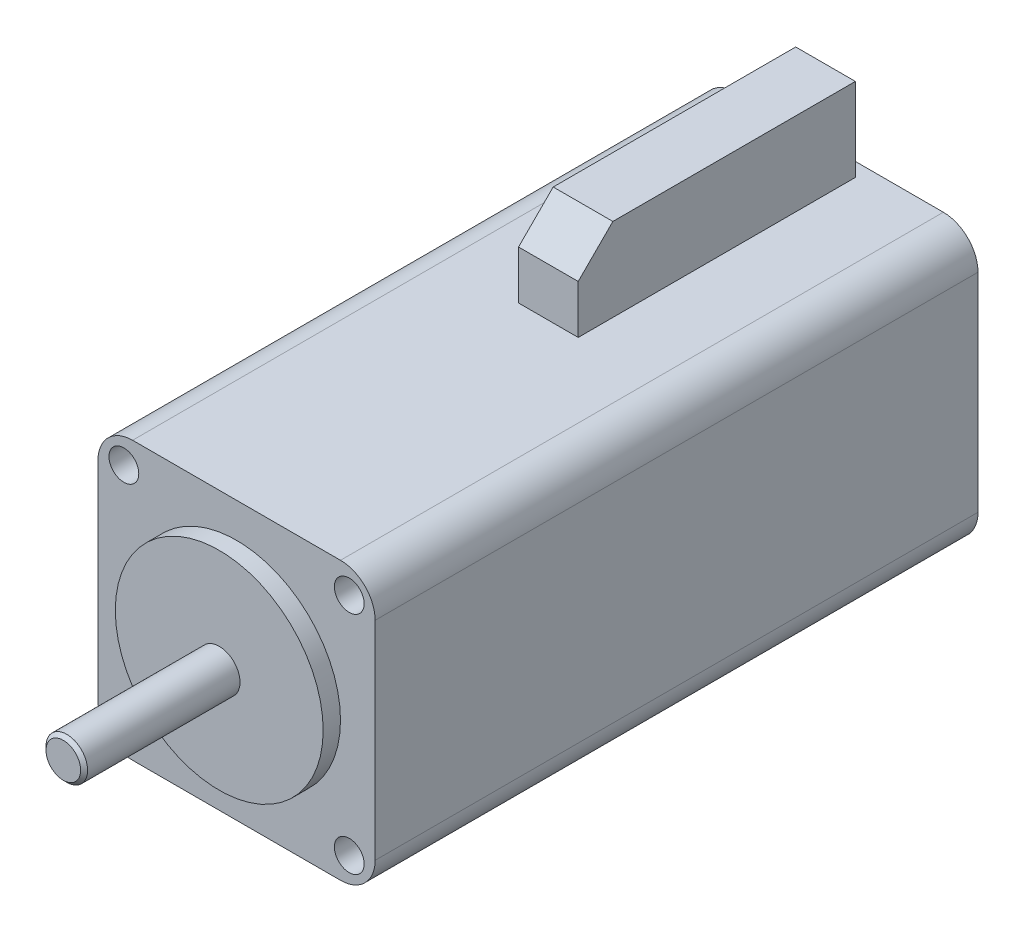
ISO-10303-21;
HEADER;
FILE_DESCRIPTION(('STEP AP214'),'2;1');
FILE_NAME('part.step','',(''),(''),'','','');
FILE_SCHEMA(('AUTOMOTIVE_DESIGN { 1 0 10303 214 1 1 1 1 }'));
ENDSEC;
DATA;
#1=APPLICATION_CONTEXT('core data for automotive mechanical design processes');
#2=APPLICATION_PROTOCOL_DEFINITION('international standard','automotive_design',2000,#1);
#3=PRODUCT_CONTEXT('',#1,'mechanical');
#4=PRODUCT('Part','Part','',(#3));
#5=PRODUCT_RELATED_PRODUCT_CATEGORY('part','',(#4));
#6=PRODUCT_DEFINITION_FORMATION('','',#4);
#7=PRODUCT_DEFINITION_CONTEXT('part definition',#1,'design');
#8=PRODUCT_DEFINITION('design','',#6,#7);
#9=PRODUCT_DEFINITION_SHAPE('','',#8);
#10=(LENGTH_UNIT() NAMED_UNIT(*) SI_UNIT(.MILLI.,.METRE.));
#11=(NAMED_UNIT(*) PLANE_ANGLE_UNIT() SI_UNIT($,.RADIAN.));
#12=(NAMED_UNIT(*) SI_UNIT($,.STERADIAN.) SOLID_ANGLE_UNIT());
#13=UNCERTAINTY_MEASURE_WITH_UNIT(LENGTH_MEASURE(1.E-05),#10,'distance_accuracy_value','');
#14=(GEOMETRIC_REPRESENTATION_CONTEXT(3) GLOBAL_UNCERTAINTY_ASSIGNED_CONTEXT((#13)) GLOBAL_UNIT_ASSIGNED_CONTEXT((#10,
#11,#12)) REPRESENTATION_CONTEXT('',''));
#15=CARTESIAN_POINT('',(0.,0.,0.));
#16=DIRECTION('',(0.,0.,1.));
#17=DIRECTION('',(1.,0.,0.));
#18=AXIS2_PLACEMENT_3D('',#15,#16,#17);
#19=CARTESIAN_POINT('',(-20.,20.,5.));
#20=DIRECTION('',(0.,-1.,0.));
#21=DIRECTION('',(0.,0.,-1.));
#22=AXIS2_PLACEMENT_3D('',#19,#20,#21);
#23=PLANE('',#22);
#24=DIRECTION('',(0.,0.,-1.));
#25=VECTOR('',#24,1.);
#26=CARTESIAN_POINT('',(15.,20.,5.));
#27=LINE('',#26,#25);
#28=CARTESIAN_POINT('',(15.,20.,5.));
#29=VERTEX_POINT('',#28);
#30=CARTESIAN_POINT('',(15.,20.,-82.));
#31=VERTEX_POINT('',#30);
#32=EDGE_CURVE('E244',#29,#31,#27,.T.);
#33=ORIENTED_EDGE('',*,*,#32,.T.);
#34=DIRECTION('',(1.,0.,0.));
#35=VECTOR('',#34,1.);
#36=CARTESIAN_POINT('',(15.,20.,-82.));
#37=LINE('',#36,#35);
#38=CARTESIAN_POINT('',(-15.,20.,-82.));
#39=VERTEX_POINT('',#38);
#40=EDGE_CURVE('E194',#39,#31,#37,.T.);
#41=ORIENTED_EDGE('',*,*,#40,.F.);
#42=DIRECTION('',(0.,0.,-1.));
#43=VECTOR('',#42,1.);
#44=CARTESIAN_POINT('',(-15.,20.,5.));
#45=LINE('',#44,#43);
#46=CARTESIAN_POINT('',(-15.,20.,5.));
#47=VERTEX_POINT('',#46);
#48=EDGE_CURVE('E246',#39,#47,#45,.F.);
#49=ORIENTED_EDGE('',*,*,#48,.T.);
#50=DIRECTION('',(-1.,0.,0.));
#51=VECTOR('',#50,1.);
#52=CARTESIAN_POINT('',(-20.,20.,5.));
#53=LINE('',#52,#51);
#54=EDGE_CURVE('E215',#29,#47,#53,.T.);
#55=ORIENTED_EDGE('',*,*,#54,.F.);
#56=EDGE_LOOP('',(#33,#41,#49,#55));
#57=FACE_BOUND('',#56,.T.);
#58=DIRECTION('',(0.,0.,-1.));
#59=VECTOR('',#58,1.);
#60=CARTESIAN_POINT('',(4.30557774335308,20.,-80.));
#61=LINE('',#60,#59);
#62=CARTESIAN_POINT('',(4.30557774335308,20.,-40.));
#63=VERTEX_POINT('',#62);
#64=CARTESIAN_POINT('',(4.30557774335307,20.,-80.));
#65=VERTEX_POINT('',#64);
#66=EDGE_CURVE('E149',#63,#65,#61,.T.);
#67=ORIENTED_EDGE('',*,*,#66,.F.);
#68=DIRECTION('',(1.,0.,0.));
#69=VECTOR('',#68,1.);
#70=CARTESIAN_POINT('',(-4.30557774335308,20.,-40.));
#71=LINE('',#70,#69);
#72=CARTESIAN_POINT('',(-4.30557774335307,20.,-40.));
#73=VERTEX_POINT('',#72);
#74=EDGE_CURVE('E134',#73,#63,#71,.T.);
#75=ORIENTED_EDGE('',*,*,#74,.F.);
#76=DIRECTION('',(0.,0.,1.));
#77=VECTOR('',#76,1.);
#78=CARTESIAN_POINT('',(-4.30557774335308,20.,-80.));
#79=LINE('',#78,#77);
#80=CARTESIAN_POINT('',(-4.30557774335308,20.,-80.));
#81=VERTEX_POINT('',#80);
#82=EDGE_CURVE('E421',#81,#73,#79,.T.);
#83=ORIENTED_EDGE('',*,*,#82,.F.);
#84=DIRECTION('',(-1.,0.,0.));
#85=VECTOR('',#84,1.);
#86=CARTESIAN_POINT('',(-4.30557774335308,20.,-80.));
#87=LINE('',#86,#85);
#88=EDGE_CURVE('E419',#65,#81,#87,.T.);
#89=ORIENTED_EDGE('',*,*,#88,.F.);
#90=EDGE_LOOP('',(#67,#75,#83,#89));
#91=FACE_BOUND('',#90,.T.);
#92=ADVANCED_FACE('F33',(#57,#91),#23,.F.);
#93=CARTESIAN_POINT('',(0.,0.,7.5));
#94=DIRECTION('',(0.,0.,1.));
#95=DIRECTION('',(1.,0.,0.));
#96=AXIS2_PLACEMENT_3D('',#93,#94,#95);
#97=PLANE('',#96);
#98=CARTESIAN_POINT('',(0.,0.,7.5));
#99=DIRECTION('',(0.,0.,1.));
#100=DIRECTION('',(1.,0.,0.));
#101=AXIS2_PLACEMENT_3D('',#98,#99,#100);
#102=CIRCLE('',#101,15.);
#103=CARTESIAN_POINT('',(15.,0.,7.5));
#104=VERTEX_POINT('',#103);
#105=EDGE_CURVE('E207',#104,#104,#102,.T.);
#106=ORIENTED_EDGE('',*,*,#105,.T.);
#107=EDGE_LOOP('',(#106));
#108=FACE_BOUND('',#107,.T.);
#109=CARTESIAN_POINT('',(0.,0.,7.5));
#110=DIRECTION('',(0.,0.,1.));
#111=DIRECTION('',(1.,0.,0.));
#112=AXIS2_PLACEMENT_3D('',#109,#110,#111);
#113=CIRCLE('',#112,3.);
#114=CARTESIAN_POINT('',(-3.,0.,7.5));
#115=VERTEX_POINT('',#114);
#116=EDGE_CURVE('E203',#115,#115,#113,.T.);
#117=ORIENTED_EDGE('',*,*,#116,.F.);
#118=EDGE_LOOP('',(#117));
#119=FACE_BOUND('',#118,.T.);
#120=ADVANCED_FACE('F279',(#108,#119),#97,.T.);
#121=CARTESIAN_POINT('',(0.,0.,5.));
#122=DIRECTION('',(0.,0.,1.));
#123=DIRECTION('',(1.,0.,0.));
#124=AXIS2_PLACEMENT_3D('',#121,#122,#123);
#125=PLANE('',#124);
#126=CARTESIAN_POINT('',(-16.2634559672897,-16.2634559672906,5.));
#127=DIRECTION('',(0.,0.,1.));
#128=DIRECTION('',(1.,0.,0.));
#129=AXIS2_PLACEMENT_3D('',#126,#127,#128);
#130=CIRCLE('',#129,2.15);
#131=CARTESIAN_POINT('',(-14.1134559672897,-16.2634559672906,5.));
#132=VERTEX_POINT('',#131);
#133=EDGE_CURVE('E150',#132,#132,#130,.T.);
#134=ORIENTED_EDGE('',*,*,#133,.F.);
#135=EDGE_LOOP('',(#134));
#136=FACE_BOUND('',#135,.T.);
#137=CARTESIAN_POINT('',(16.2634559672915,-16.2634559672897,5.));
#138=DIRECTION('',(0.,0.,1.));
#139=DIRECTION('',(1.,0.,0.));
#140=AXIS2_PLACEMENT_3D('',#137,#138,#139);
#141=CIRCLE('',#140,2.15);
#142=CARTESIAN_POINT('',(18.4134559672915,-16.2634559672897,5.));
#143=VERTEX_POINT('',#142);
#144=EDGE_CURVE('E160',#143,#143,#141,.T.);
#145=ORIENTED_EDGE('',*,*,#144,.F.);
#146=EDGE_LOOP('',(#145));
#147=FACE_BOUND('',#146,.T.);
#148=CARTESIAN_POINT('',(16.2634559672906,16.2634559672915,5.));
#149=DIRECTION('',(0.,0.,1.));
#150=DIRECTION('',(1.,0.,0.));
#151=AXIS2_PLACEMENT_3D('',#148,#149,#150);
#152=CIRCLE('',#151,2.15000000000094);
#153=CARTESIAN_POINT('',(18.4134559672915,16.2634559672915,5.));
#154=VERTEX_POINT('',#153);
#155=EDGE_CURVE('E165',#154,#154,#152,.T.);
#156=ORIENTED_EDGE('',*,*,#155,.F.);
#157=EDGE_LOOP('',(#156));
#158=FACE_BOUND('',#157,.T.);
#159=CARTESIAN_POINT('',(-16.2634559672906,16.2634559672906,5.));
#160=DIRECTION('',(0.,0.,1.));
#161=DIRECTION('',(1.,0.,0.));
#162=AXIS2_PLACEMENT_3D('',#159,#160,#161);
#163=CIRCLE('',#162,2.15);
#164=CARTESIAN_POINT('',(-14.1134559672906,16.2634559672906,5.));
#165=VERTEX_POINT('',#164);
#166=EDGE_CURVE('E171',#165,#165,#163,.T.);
#167=ORIENTED_EDGE('',*,*,#166,.F.);
#168=EDGE_LOOP('',(#167));
#169=FACE_BOUND('',#168,.T.);
#170=DIRECTION('',(1.,0.,0.));
#171=VECTOR('',#170,1.);
#172=CARTESIAN_POINT('',(-20.,-20.,5.));
#173=LINE('',#172,#171);
#174=CARTESIAN_POINT('',(-15.,-20.,5.));
#175=VERTEX_POINT('',#174);
#176=CARTESIAN_POINT('',(15.,-20.,5.));
#177=VERTEX_POINT('',#176);
#178=EDGE_CURVE('E221',#175,#177,#173,.T.);
#179=ORIENTED_EDGE('',*,*,#178,.T.);
#180=CARTESIAN_POINT('',(15.,-15.,5.));
#181=DIRECTION('',(0.,0.,1.));
#182=DIRECTION('',(1.,0.,0.));
#183=AXIS2_PLACEMENT_3D('',#180,#181,#182);
#184=CIRCLE('',#183,5.);
#185=CARTESIAN_POINT('',(20.,-15.,5.));
#186=VERTEX_POINT('',#185);
#187=EDGE_CURVE('E238',#177,#186,#184,.T.);
#188=ORIENTED_EDGE('',*,*,#187,.T.);
#189=DIRECTION('',(0.,1.,0.));
#190=VECTOR('',#189,1.);
#191=CARTESIAN_POINT('',(20.,20.,5.));
#192=LINE('',#191,#190);
#193=CARTESIAN_POINT('',(20.,15.,5.));
#194=VERTEX_POINT('',#193);
#195=EDGE_CURVE('E210',#186,#194,#192,.T.);
#196=ORIENTED_EDGE('',*,*,#195,.T.);
#197=CARTESIAN_POINT('',(15.,15.,5.));
#198=DIRECTION('',(0.,0.,1.));
#199=DIRECTION('',(1.,0.,0.));
#200=AXIS2_PLACEMENT_3D('',#197,#198,#199);
#201=CIRCLE('',#200,5.);
#202=EDGE_CURVE('E232',#194,#29,#201,.T.);
#203=ORIENTED_EDGE('',*,*,#202,.T.);
#204=ORIENTED_EDGE('',*,*,#54,.T.);
#205=CARTESIAN_POINT('',(-15.,15.,5.));
#206=DIRECTION('',(0.,0.,1.));
#207=DIRECTION('',(1.,0.,0.));
#208=AXIS2_PLACEMENT_3D('',#205,#206,#207);
#209=CIRCLE('',#208,5.);
#210=CARTESIAN_POINT('',(-20.,15.,5.));
#211=VERTEX_POINT('',#210);
#212=EDGE_CURVE('E234',#47,#211,#209,.T.);
#213=ORIENTED_EDGE('',*,*,#212,.T.);
#214=DIRECTION('',(0.,-1.,0.));
#215=VECTOR('',#214,1.);
#216=CARTESIAN_POINT('',(-20.,20.,5.));
#217=LINE('',#216,#215);
#218=CARTESIAN_POINT('',(-20.,-15.,5.));
#219=VERTEX_POINT('',#218);
#220=EDGE_CURVE('E218',#211,#219,#217,.T.);
#221=ORIENTED_EDGE('',*,*,#220,.T.);
#222=CARTESIAN_POINT('',(-15.,-15.,5.));
#223=DIRECTION('',(0.,0.,1.));
#224=DIRECTION('',(1.,0.,0.));
#225=AXIS2_PLACEMENT_3D('',#222,#223,#224);
#226=CIRCLE('',#225,5.);
#227=EDGE_CURVE('E236',#219,#175,#226,.T.);
#228=ORIENTED_EDGE('',*,*,#227,.T.);
#229=EDGE_LOOP('',(#179,#188,#196,#203,#204,#213,#221,#228));
#230=FACE_BOUND('',#229,.T.);
#231=CARTESIAN_POINT('',(0.,0.,5.));
#232=DIRECTION('',(0.,0.,1.));
#233=DIRECTION('',(1.,0.,0.));
#234=AXIS2_PLACEMENT_3D('',#231,#232,#233);
#235=CIRCLE('',#234,15.);
#236=CARTESIAN_POINT('',(15.,0.,5.));
#237=VERTEX_POINT('',#236);
#238=EDGE_CURVE('E206',#237,#237,#235,.T.);
#239=ORIENTED_EDGE('',*,*,#238,.F.);
#240=EDGE_LOOP('',(#239));
#241=FACE_BOUND('',#240,.T.);
#242=ADVANCED_FACE('F285',(#136,#147,#158,#169,#230,#241),#125,.T.);
#243=CARTESIAN_POINT('',(20.,20.,5.));
#244=DIRECTION('',(-1.,0.,0.));
#245=DIRECTION('',(0.,-1.,0.));
#246=AXIS2_PLACEMENT_3D('',#243,#244,#245);
#247=PLANE('',#246);
#248=ORIENTED_EDGE('',*,*,#195,.F.);
#249=DIRECTION('',(0.,0.,-1.));
#250=VECTOR('',#249,1.);
#251=CARTESIAN_POINT('',(20.,-15.,5.));
#252=LINE('',#251,#250);
#253=CARTESIAN_POINT('',(20.,-15.,-82.));
#254=VERTEX_POINT('',#253);
#255=EDGE_CURVE('E226',#186,#254,#252,.T.);
#256=ORIENTED_EDGE('',*,*,#255,.T.);
#257=DIRECTION('',(0.,-1.,0.));
#258=VECTOR('',#257,1.);
#259=CARTESIAN_POINT('',(20.,-15.,-82.));
#260=LINE('',#259,#258);
#261=CARTESIAN_POINT('',(20.,15.,-82.));
#262=VERTEX_POINT('',#261);
#263=EDGE_CURVE('E200',#262,#254,#260,.T.);
#264=ORIENTED_EDGE('',*,*,#263,.F.);
#265=DIRECTION('',(0.,0.,-1.));
#266=VECTOR('',#265,1.);
#267=CARTESIAN_POINT('',(20.,15.,5.));
#268=LINE('',#267,#266);
#269=EDGE_CURVE('E224',#262,#194,#268,.F.);
#270=ORIENTED_EDGE('',*,*,#269,.T.);
#271=EDGE_LOOP('',(#248,#256,#264,#270));
#272=FACE_BOUND('',#271,.T.);
#273=ADVANCED_FACE('F293',(#272),#247,.F.);
#274=CARTESIAN_POINT('',(-20.,20.,5.));
#275=DIRECTION('',(1.,0.,0.));
#276=DIRECTION('',(0.,1.,0.));
#277=AXIS2_PLACEMENT_3D('',#274,#275,#276);
#278=PLANE('',#277);
#279=DIRECTION('',(0.,0.,-1.));
#280=VECTOR('',#279,1.);
#281=CARTESIAN_POINT('',(-20.,15.,5.));
#282=LINE('',#281,#280);
#283=CARTESIAN_POINT('',(-20.,15.,-82.));
#284=VERTEX_POINT('',#283);
#285=EDGE_CURVE('E240',#211,#284,#282,.T.);
#286=ORIENTED_EDGE('',*,*,#285,.T.);
#287=DIRECTION('',(0.,1.,0.));
#288=VECTOR('',#287,1.);
#289=CARTESIAN_POINT('',(-20.,15.,-82.));
#290=LINE('',#289,#288);
#291=CARTESIAN_POINT('',(-20.,-15.,-82.));
#292=VERTEX_POINT('',#291);
#293=EDGE_CURVE('E188',#292,#284,#290,.T.);
#294=ORIENTED_EDGE('',*,*,#293,.F.);
#295=DIRECTION('',(0.,0.,-1.));
#296=VECTOR('',#295,1.);
#297=CARTESIAN_POINT('',(-20.,-15.,5.));
#298=LINE('',#297,#296);
#299=EDGE_CURVE('E242',#292,#219,#298,.F.);
#300=ORIENTED_EDGE('',*,*,#299,.T.);
#301=ORIENTED_EDGE('',*,*,#220,.F.);
#302=EDGE_LOOP('',(#286,#294,#300,#301));
#303=FACE_BOUND('',#302,.T.);
#304=ADVANCED_FACE('F291',(#303),#278,.F.);
#305=CARTESIAN_POINT('',(-20.,-20.,5.));
#306=DIRECTION('',(0.,1.,0.));
#307=DIRECTION('',(0.,0.,1.));
#308=AXIS2_PLACEMENT_3D('',#305,#306,#307);
#309=PLANE('',#308);
#310=DIRECTION('',(0.,0.,-1.));
#311=VECTOR('',#310,1.);
#312=CARTESIAN_POINT('',(-15.,-20.,5.));
#313=LINE('',#312,#311);
#314=CARTESIAN_POINT('',(-15.,-20.,-82.));
#315=VERTEX_POINT('',#314);
#316=EDGE_CURVE('E228',#175,#315,#313,.T.);
#317=ORIENTED_EDGE('',*,*,#316,.T.);
#318=DIRECTION('',(-1.,0.,0.));
#319=VECTOR('',#318,1.);
#320=CARTESIAN_POINT('',(-15.,-20.,-82.));
#321=LINE('',#320,#319);
#322=CARTESIAN_POINT('',(15.,-20.,-82.));
#323=VERTEX_POINT('',#322);
#324=EDGE_CURVE('E182',#323,#315,#321,.T.);
#325=ORIENTED_EDGE('',*,*,#324,.F.);
#326=DIRECTION('',(0.,0.,-1.));
#327=VECTOR('',#326,1.);
#328=CARTESIAN_POINT('',(15.,-20.,5.));
#329=LINE('',#328,#327);
#330=EDGE_CURVE('E230',#323,#177,#329,.F.);
#331=ORIENTED_EDGE('',*,*,#330,.T.);
#332=ORIENTED_EDGE('',*,*,#178,.F.);
#333=EDGE_LOOP('',(#317,#325,#331,#332));
#334=FACE_BOUND('',#333,.T.);
#335=ADVANCED_FACE('F301',(#334),#309,.F.);
#336=CARTESIAN_POINT('',(15.,-15.,5.));
#337=DIRECTION('',(0.,0.,-1.));
#338=DIRECTION('',(-1.,0.,0.));
#339=AXIS2_PLACEMENT_3D('',#336,#337,#338);
#340=CYLINDRICAL_SURFACE('',#339,5.);
#341=ORIENTED_EDGE('',*,*,#187,.F.);
#342=ORIENTED_EDGE('',*,*,#330,.F.);
#343=CARTESIAN_POINT('',(15.,-15.,-82.));
#344=DIRECTION('',(0.,0.,-1.));
#345=DIRECTION('',(-1.,0.,0.));
#346=AXIS2_PLACEMENT_3D('',#343,#344,#345);
#347=CIRCLE('',#346,5.);
#348=EDGE_CURVE('E177',#254,#323,#347,.T.);
#349=ORIENTED_EDGE('',*,*,#348,.F.);
#350=ORIENTED_EDGE('',*,*,#255,.F.);
#351=EDGE_LOOP('',(#341,#342,#349,#350));
#352=FACE_BOUND('',#351,.T.);
#353=ADVANCED_FACE('F297',(#352),#340,.T.);
#354=CARTESIAN_POINT('',(-15.,-15.,5.));
#355=DIRECTION('',(0.,0.,-1.));
#356=DIRECTION('',(-1.,0.,0.));
#357=AXIS2_PLACEMENT_3D('',#354,#355,#356);
#358=CYLINDRICAL_SURFACE('',#357,5.);
#359=ORIENTED_EDGE('',*,*,#227,.F.);
#360=ORIENTED_EDGE('',*,*,#299,.F.);
#361=CARTESIAN_POINT('',(-15.,-15.,-82.));
#362=DIRECTION('',(0.,0.,-1.));
#363=DIRECTION('',(-1.,0.,0.));
#364=AXIS2_PLACEMENT_3D('',#361,#362,#363);
#365=CIRCLE('',#364,5.);
#366=EDGE_CURVE('E185',#315,#292,#365,.T.);
#367=ORIENTED_EDGE('',*,*,#366,.F.);
#368=ORIENTED_EDGE('',*,*,#316,.F.);
#369=EDGE_LOOP('',(#359,#360,#367,#368));
#370=FACE_BOUND('',#369,.T.);
#371=ADVANCED_FACE('F300',(#370),#358,.T.);
#372=CARTESIAN_POINT('',(-15.,15.,5.));
#373=DIRECTION('',(0.,0.,-1.));
#374=DIRECTION('',(-1.,0.,0.));
#375=AXIS2_PLACEMENT_3D('',#372,#373,#374);
#376=CYLINDRICAL_SURFACE('',#375,5.);
#377=ORIENTED_EDGE('',*,*,#212,.F.);
#378=ORIENTED_EDGE('',*,*,#48,.F.);
#379=CARTESIAN_POINT('',(-15.,15.,-82.));
#380=DIRECTION('',(0.,0.,-1.));
#381=DIRECTION('',(-1.,0.,0.));
#382=AXIS2_PLACEMENT_3D('',#379,#380,#381);
#383=CIRCLE('',#382,5.);
#384=EDGE_CURVE('E191',#284,#39,#383,.T.);
#385=ORIENTED_EDGE('',*,*,#384,.F.);
#386=ORIENTED_EDGE('',*,*,#285,.F.);
#387=EDGE_LOOP('',(#377,#378,#385,#386));
#388=FACE_BOUND('',#387,.T.);
#389=ADVANCED_FACE('F305',(#388),#376,.T.);
#390=CARTESIAN_POINT('',(15.,15.,5.));
#391=DIRECTION('',(0.,0.,-1.));
#392=DIRECTION('',(-1.,0.,0.));
#393=AXIS2_PLACEMENT_3D('',#390,#391,#392);
#394=CYLINDRICAL_SURFACE('',#393,5.);
#395=ORIENTED_EDGE('',*,*,#202,.F.);
#396=ORIENTED_EDGE('',*,*,#269,.F.);
#397=CARTESIAN_POINT('',(15.,15.,-82.));
#398=DIRECTION('',(0.,0.,-1.));
#399=DIRECTION('',(-1.,0.,0.));
#400=AXIS2_PLACEMENT_3D('',#397,#398,#399);
#401=CIRCLE('',#400,5.);
#402=EDGE_CURVE('E197',#31,#262,#401,.T.);
#403=ORIENTED_EDGE('',*,*,#402,.F.);
#404=ORIENTED_EDGE('',*,*,#32,.F.);
#405=EDGE_LOOP('',(#395,#396,#403,#404));
#406=FACE_BOUND('',#405,.T.);
#407=ADVANCED_FACE('F309',(#406),#394,.T.);
#408=CARTESIAN_POINT('',(0.,0.,7.5));
#409=DIRECTION('',(0.,0.,-1.));
#410=DIRECTION('',(-1.,0.,0.));
#411=AXIS2_PLACEMENT_3D('',#408,#409,#410);
#412=CYLINDRICAL_SURFACE('',#411,15.);
#413=ORIENTED_EDGE('',*,*,#105,.F.);
#414=EDGE_LOOP('',(#413));
#415=FACE_BOUND('',#414,.T.);
#416=ORIENTED_EDGE('',*,*,#238,.T.);
#417=EDGE_LOOP('',(#416));
#418=FACE_BOUND('',#417,.T.);
#419=ADVANCED_FACE('F276',(#415,#418),#412,.T.);
#420=CARTESIAN_POINT('',(0.,0.,30.));
#421=DIRECTION('',(0.,0.,-1.));
#422=DIRECTION('',(-1.,0.,0.));
#423=AXIS2_PLACEMENT_3D('',#420,#421,#422);
#424=CYLINDRICAL_SURFACE('',#423,3.);
#425=CARTESIAN_POINT('',(0.,0.,29.5));
#426=DIRECTION('',(0.,0.,1.));
#427=DIRECTION('',(1.,0.,0.));
#428=AXIS2_PLACEMENT_3D('',#425,#426,#427);
#429=CIRCLE('',#428,3.);
#430=CARTESIAN_POINT('',(-3.,0.,29.5));
#431=VERTEX_POINT('',#430);
#432=EDGE_CURVE('E251',#431,#431,#429,.F.);
#433=CARTESIAN_POINT('',(-3.,0.,29.5));
#434=CARTESIAN_POINT('',(-3.,0.,29.2708333333334));
#435=CARTESIAN_POINT('',(-3.,0.,29.0416666666667));
#436=CARTESIAN_POINT('',(-3.,0.,28.5833333333334));
#437=CARTESIAN_POINT('',(-3.,0.,28.3541666666667));
#438=CARTESIAN_POINT('',(-3.,0.,27.8958333333334));
#439=CARTESIAN_POINT('',(-3.,0.,27.6666666666667));
#440=CARTESIAN_POINT('',(-3.,0.,27.2083333333334));
#441=CARTESIAN_POINT('',(-3.,0.,26.9791666666667));
#442=CARTESIAN_POINT('',(-3.,0.,26.5208333333334));
#443=CARTESIAN_POINT('',(-3.,0.,26.2916666666667));
#444=CARTESIAN_POINT('',(-3.,0.,25.8333333333334));
#445=CARTESIAN_POINT('',(-3.,0.,25.6041666666667));
#446=CARTESIAN_POINT('',(-3.,0.,25.1458333333334));
#447=CARTESIAN_POINT('',(-3.,0.,24.9166666666667));
#448=CARTESIAN_POINT('',(-3.,0.,24.4583333333334));
#449=CARTESIAN_POINT('',(-3.,0.,24.2291666666667));
#450=CARTESIAN_POINT('',(-3.,0.,23.7708333333334));
#451=CARTESIAN_POINT('',(-3.,0.,23.5416666666667));
#452=CARTESIAN_POINT('',(-3.,0.,23.0833333333334));
#453=CARTESIAN_POINT('',(-3.,0.,22.8541666666667));
#454=CARTESIAN_POINT('',(-3.,0.,22.3958333333334));
#455=CARTESIAN_POINT('',(-3.,0.,22.1666666666667));
#456=CARTESIAN_POINT('',(-3.,0.,21.7083333333334));
#457=CARTESIAN_POINT('',(-3.,0.,21.4791666666667));
#458=CARTESIAN_POINT('',(-3.,0.,21.0208333333334));
#459=CARTESIAN_POINT('',(-3.,0.,20.7916666666667));
#460=CARTESIAN_POINT('',(-3.,0.,20.3333333333334));
#461=CARTESIAN_POINT('',(-3.,0.,20.1041666666667));
#462=CARTESIAN_POINT('',(-3.,0.,19.6458333333334));
#463=CARTESIAN_POINT('',(-3.,0.,19.4166666666667));
#464=CARTESIAN_POINT('',(-3.,0.,18.9583333333334));
#465=CARTESIAN_POINT('',(-3.,0.,18.7291666666667));
#466=CARTESIAN_POINT('',(-3.,0.,18.2708333333334));
#467=CARTESIAN_POINT('',(-3.,0.,18.0416666666667));
#468=CARTESIAN_POINT('',(-3.,0.,17.5833333333334));
#469=CARTESIAN_POINT('',(-3.,0.,17.3541666666667));
#470=CARTESIAN_POINT('',(-3.,0.,16.8958333333333));
#471=CARTESIAN_POINT('',(-3.,0.,16.6666666666667));
#472=CARTESIAN_POINT('',(-3.,0.,16.2083333333333));
#473=CARTESIAN_POINT('',(-3.,0.,15.9791666666667));
#474=CARTESIAN_POINT('',(-3.,0.,15.5208333333333));
#475=CARTESIAN_POINT('',(-3.,0.,15.2916666666667));
#476=CARTESIAN_POINT('',(-3.,0.,14.8333333333333));
#477=CARTESIAN_POINT('',(-3.,0.,14.6041666666667));
#478=CARTESIAN_POINT('',(-3.,0.,14.1458333333333));
#479=CARTESIAN_POINT('',(-3.,0.,13.9166666666667));
#480=CARTESIAN_POINT('',(-3.,0.,13.4583333333333));
#481=CARTESIAN_POINT('',(-3.,0.,13.2291666666667));
#482=CARTESIAN_POINT('',(-3.,0.,12.7708333333333));
#483=CARTESIAN_POINT('',(-3.,0.,12.5416666666667));
#484=CARTESIAN_POINT('',(-3.,0.,12.0833333333333));
#485=CARTESIAN_POINT('',(-3.,0.,11.8541666666667));
#486=CARTESIAN_POINT('',(-3.,0.,11.3958333333333));
#487=CARTESIAN_POINT('',(-3.,0.,11.1666666666667));
#488=CARTESIAN_POINT('',(-3.,0.,10.7083333333333));
#489=CARTESIAN_POINT('',(-3.,0.,10.4791666666667));
#490=CARTESIAN_POINT('',(-3.,0.,10.0208333333333));
#491=CARTESIAN_POINT('',(-3.,0.,9.79166666666667));
#492=CARTESIAN_POINT('',(-3.,0.,9.33333333333333));
#493=CARTESIAN_POINT('',(-3.,0.,9.10416666666667));
#494=CARTESIAN_POINT('',(-3.,0.,8.64583333333333));
#495=CARTESIAN_POINT('',(-3.,0.,8.41666666666666));
#496=CARTESIAN_POINT('',(-3.,0.,7.95833333333333));
#497=CARTESIAN_POINT('',(-3.,0.,7.72916666666666));
#498=CARTESIAN_POINT('',(-3.,0.,7.5));
#499=B_SPLINE_CURVE_WITH_KNOTS('',3,(#433,#434,#435,#436,#437,#438,#439,#440,#441,#442,#443,
#444,#445,#446,#447,#448,#449,#450,#451,#452,#453,#454,#455,#456,#457,#458,#459,#460,#461,#462,
#463,#464,#465,#466,#467,#468,#469,#470,#471,#472,#473,#474,#475,#476,#477,#478,#479,#480,#481,
#482,#483,#484,#485,#486,#487,#488,#489,#490,#491,#492,#493,#494,#495,#496,#497,#498),
.UNSPECIFIED.,.F.,.F.,(4,2,2,2,2,2,2,2,2,2,2,2,2,2,2,2,2,2,2,2,2,2,2,2,2,2,2,2,2,2,2,2,4),(0.,
0.687500000000001,1.375,2.0625,2.75000000000001,3.43750000000001,4.12500000000001,
4.81250000000001,5.50000000000001,6.18750000000001,6.87500000000001,7.56250000000001,
8.25000000000002,8.93750000000002,9.62500000000002,10.3125,11.,11.6875,12.375,13.0625,13.75,
14.4375,15.125,15.8125,16.5,17.1875,17.875,18.5625,19.25,19.9375,20.625,21.3125,22.),.UNSPECIFIED.);
#500=EDGE_CURVE('BSEAM257',#431,#115,#499,.T.);
#501=ORIENTED_EDGE('',*,*,#432,.T.);
#502=ORIENTED_EDGE('',*,*,#116,.T.);
#503=ORIENTED_EDGE('',*,*,#500,.T.);
#504=ORIENTED_EDGE('',*,*,#500,.F.);
#505=EDGE_LOOP('',(#501,#503,#502,#504));
#506=FACE_BOUND('',#505,.T.);
#507=ADVANCED_FACE('F257',(#506),#424,.T.);
#508=CARTESIAN_POINT('',(0.,0.,30.));
#509=DIRECTION('',(0.,0.,1.));
#510=DIRECTION('',(1.,0.,0.));
#511=AXIS2_PLACEMENT_3D('',#508,#509,#510);
#512=PLANE('',#511);
#513=CARTESIAN_POINT('',(0.,0.,30.));
#514=DIRECTION('',(0.,0.,1.));
#515=DIRECTION('',(1.,0.,0.));
#516=AXIS2_PLACEMENT_3D('',#513,#514,#515);
#517=CIRCLE('',#516,2.50000000000004);
#518=CARTESIAN_POINT('',(2.50000000000004,0.,30.));
#519=VERTEX_POINT('',#518);
#520=EDGE_CURVE('E248',#519,#519,#517,.T.);
#521=ORIENTED_EDGE('',*,*,#520,.T.);
#522=EDGE_LOOP('',(#521));
#523=FACE_BOUND('',#522,.T.);
#524=ADVANCED_FACE('F267',(#523),#512,.T.);
#525=CARTESIAN_POINT('',(15.,-15.,-82.));
#526=DIRECTION('',(0.,0.,-1.));
#527=DIRECTION('',(-1.,0.,0.));
#528=AXIS2_PLACEMENT_3D('',#525,#526,#527);
#529=PLANE('',#528);
#530=ORIENTED_EDGE('',*,*,#348,.T.);
#531=ORIENTED_EDGE('',*,*,#324,.T.);
#532=ORIENTED_EDGE('',*,*,#366,.T.);
#533=ORIENTED_EDGE('',*,*,#293,.T.);
#534=ORIENTED_EDGE('',*,*,#384,.T.);
#535=ORIENTED_EDGE('',*,*,#40,.T.);
#536=ORIENTED_EDGE('',*,*,#402,.T.);
#537=ORIENTED_EDGE('',*,*,#263,.T.);
#538=EDGE_LOOP('',(#530,#531,#532,#533,#534,#535,#536,#537));
#539=FACE_BOUND('',#538,.T.);
#540=ADVANCED_FACE('F264',(#539),#529,.T.);
#541=CARTESIAN_POINT('',(0.,0.,30.));
#542=DIRECTION('',(0.,0.,-1.));
#543=DIRECTION('',(-1.,0.,0.));
#544=AXIS2_PLACEMENT_3D('',#541,#542,#543);
#545=CONICAL_SURFACE('',#544,2.50000000000004,0.785398163397454);
#546=ORIENTED_EDGE('',*,*,#432,.F.);
#547=EDGE_LOOP('',(#546));
#548=FACE_BOUND('',#547,.T.);
#549=ORIENTED_EDGE('',*,*,#520,.F.);
#550=EDGE_LOOP('',(#549));
#551=FACE_BOUND('',#550,.T.);
#552=ADVANCED_FACE('F260',(#548,#551),#545,.T.);
#553=CARTESIAN_POINT('',(-16.2634559672906,16.2634559672906,-5.));
#554=DIRECTION('',(0.,0.,1.));
#555=DIRECTION('',(1.,0.,0.));
#556=AXIS2_PLACEMENT_3D('',#553,#554,#555);
#557=CYLINDRICAL_SURFACE('',#556,2.15);
#558=CARTESIAN_POINT('',(-16.2634559672906,16.2634559672906,-5.));
#559=DIRECTION('',(0.,0.,1.));
#560=DIRECTION('',(1.,0.,0.));
#561=AXIS2_PLACEMENT_3D('',#558,#559,#560);
#562=CIRCLE('',#561,2.15);
#563=CARTESIAN_POINT('',(-14.1134559672906,16.2634559672906,-5.));
#564=VERTEX_POINT('',#563);
#565=EDGE_CURVE('E174',#564,#564,#562,.T.);
#566=ORIENTED_EDGE('',*,*,#565,.F.);
#567=EDGE_LOOP('',(#566));
#568=FACE_BOUND('',#567,.T.);
#569=ORIENTED_EDGE('',*,*,#166,.T.);
#570=EDGE_LOOP('',(#569));
#571=FACE_BOUND('',#570,.T.);
#572=ADVANCED_FACE('F263',(#568,#571),#557,.F.);
#573=CARTESIAN_POINT('',(-16.2634559672906,16.2634559672906,-5.));
#574=DIRECTION('',(0.,0.,1.));
#575=DIRECTION('',(1.,0.,0.));
#576=AXIS2_PLACEMENT_3D('',#573,#574,#575);
#577=PLANE('',#576);
#578=ORIENTED_EDGE('',*,*,#565,.T.);
#579=EDGE_LOOP('',(#578));
#580=FACE_BOUND('',#579,.T.);
#581=ADVANCED_FACE('F360',(#580),#577,.T.);
#582=CARTESIAN_POINT('',(16.2634559672906,16.2634559672915,-5.));
#583=DIRECTION('',(0.,0.,1.));
#584=DIRECTION('',(1.,0.,0.));
#585=AXIS2_PLACEMENT_3D('',#582,#583,#584);
#586=CYLINDRICAL_SURFACE('',#585,2.15000000000094);
#587=CARTESIAN_POINT('',(16.2634559672906,16.2634559672915,-5.));
#588=DIRECTION('',(0.,0.,1.));
#589=DIRECTION('',(1.,0.,0.));
#590=AXIS2_PLACEMENT_3D('',#587,#588,#589);
#591=CIRCLE('',#590,2.15000000000094);
#592=CARTESIAN_POINT('',(18.4134559672915,16.2634559672915,-5.));
#593=VERTEX_POINT('',#592);
#594=EDGE_CURVE('E168',#593,#593,#591,.T.);
#595=ORIENTED_EDGE('',*,*,#594,.F.);
#596=EDGE_LOOP('',(#595));
#597=FACE_BOUND('',#596,.T.);
#598=ORIENTED_EDGE('',*,*,#155,.T.);
#599=EDGE_LOOP('',(#598));
#600=FACE_BOUND('',#599,.T.);
#601=ADVANCED_FACE('F366',(#597,#600),#586,.F.);
#602=CARTESIAN_POINT('',(16.2634559672906,16.2634559672915,-5.));
#603=DIRECTION('',(0.,0.,1.));
#604=DIRECTION('',(1.,0.,0.));
#605=AXIS2_PLACEMENT_3D('',#602,#603,#604);
#606=PLANE('',#605);
#607=ORIENTED_EDGE('',*,*,#594,.T.);
#608=EDGE_LOOP('',(#607));
#609=FACE_BOUND('',#608,.T.);
#610=ADVANCED_FACE('F373',(#609),#606,.T.);
#611=CARTESIAN_POINT('',(16.2634559672915,-16.2634559672897,-5.));
#612=DIRECTION('',(0.,0.,1.));
#613=DIRECTION('',(1.,0.,0.));
#614=AXIS2_PLACEMENT_3D('',#611,#612,#613);
#615=CYLINDRICAL_SURFACE('',#614,2.15);
#616=CARTESIAN_POINT('',(16.2634559672915,-16.2634559672897,-5.));
#617=DIRECTION('',(0.,0.,1.));
#618=DIRECTION('',(1.,0.,0.));
#619=AXIS2_PLACEMENT_3D('',#616,#617,#618);
#620=CIRCLE('',#619,2.15);
#621=CARTESIAN_POINT('',(18.4134559672915,-16.2634559672897,-5.));
#622=VERTEX_POINT('',#621);
#623=EDGE_CURVE('E162',#622,#622,#620,.T.);
#624=ORIENTED_EDGE('',*,*,#623,.F.);
#625=EDGE_LOOP('',(#624));
#626=FACE_BOUND('',#625,.T.);
#627=ORIENTED_EDGE('',*,*,#144,.T.);
#628=EDGE_LOOP('',(#627));
#629=FACE_BOUND('',#628,.T.);
#630=ADVANCED_FACE('F377',(#626,#629),#615,.F.);
#631=CARTESIAN_POINT('',(16.2634559672915,-16.2634559672897,-5.));
#632=DIRECTION('',(0.,0.,1.));
#633=DIRECTION('',(1.,0.,0.));
#634=AXIS2_PLACEMENT_3D('',#631,#632,#633);
#635=PLANE('',#634);
#636=ORIENTED_EDGE('',*,*,#623,.T.);
#637=EDGE_LOOP('',(#636));
#638=FACE_BOUND('',#637,.T.);
#639=ADVANCED_FACE('F381',(#638),#635,.T.);
#640=CARTESIAN_POINT('',(-16.2634559672897,-16.2634559672906,-5.));
#641=DIRECTION('',(0.,0.,1.));
#642=DIRECTION('',(1.,0.,0.));
#643=AXIS2_PLACEMENT_3D('',#640,#641,#642);
#644=CYLINDRICAL_SURFACE('',#643,2.15);
#645=CARTESIAN_POINT('',(-16.2634559672897,-16.2634559672906,-5.));
#646=DIRECTION('',(0.,0.,1.));
#647=DIRECTION('',(1.,0.,0.));
#648=AXIS2_PLACEMENT_3D('',#645,#646,#647);
#649=CIRCLE('',#648,2.15);
#650=CARTESIAN_POINT('',(-14.1134559672897,-16.2634559672906,-5.));
#651=VERTEX_POINT('',#650);
#652=EDGE_CURVE('E153',#651,#651,#649,.T.);
#653=ORIENTED_EDGE('',*,*,#652,.F.);
#654=EDGE_LOOP('',(#653));
#655=FACE_BOUND('',#654,.T.);
#656=ORIENTED_EDGE('',*,*,#133,.T.);
#657=EDGE_LOOP('',(#656));
#658=FACE_BOUND('',#657,.T.);
#659=ADVANCED_FACE('F385',(#655,#658),#644,.F.);
#660=CARTESIAN_POINT('',(-16.2634559672897,-16.2634559672906,-5.));
#661=DIRECTION('',(0.,0.,1.));
#662=DIRECTION('',(1.,0.,0.));
#663=AXIS2_PLACEMENT_3D('',#660,#661,#662);
#664=PLANE('',#663);
#665=ORIENTED_EDGE('',*,*,#652,.T.);
#666=EDGE_LOOP('',(#665));
#667=FACE_BOUND('',#666,.T.);
#668=ADVANCED_FACE('F389',(#667),#664,.T.);
#669=CARTESIAN_POINT('',(4.30557774335308,32.,-80.));
#670=DIRECTION('',(-1.,0.,0.));
#671=DIRECTION('',(0.,0.,1.));
#672=AXIS2_PLACEMENT_3D('',#669,#670,#671);
#673=PLANE('',#672);
#674=DIRECTION('',(0.,0.,-1.));
#675=VECTOR('',#674,1.);
#676=CARTESIAN_POINT('',(4.30557774335308,32.,-80.));
#677=LINE('',#676,#675);
#678=CARTESIAN_POINT('',(4.30557774335308,32.,-45.));
#679=VERTEX_POINT('',#678);
#680=CARTESIAN_POINT('',(4.30557774335308,32.,-80.));
#681=VERTEX_POINT('',#680);
#682=EDGE_CURVE('E125',#679,#681,#677,.T.);
#683=ORIENTED_EDGE('',*,*,#682,.F.);
#684=DIRECTION('',(0.,-0.707106781186549,0.707106781186547));
#685=VECTOR('',#684,1.);
#686=CARTESIAN_POINT('',(4.30557774335308,32.,-45.));
#687=LINE('',#686,#685);
#688=CARTESIAN_POINT('',(4.30557774335308,27.,-40.));
#689=VERTEX_POINT('',#688);
#690=EDGE_CURVE('E55',#679,#689,#687,.T.);
#691=ORIENTED_EDGE('',*,*,#690,.T.);
#692=DIRECTION('',(0.,-1.,0.));
#693=VECTOR('',#692,1.);
#694=CARTESIAN_POINT('',(4.30557774335308,32.,-40.));
#695=LINE('',#694,#693);
#696=EDGE_CURVE('E414',#689,#63,#695,.T.);
#697=ORIENTED_EDGE('',*,*,#696,.T.);
#698=ORIENTED_EDGE('',*,*,#66,.T.);
#699=DIRECTION('',(0.,-1.,0.));
#700=VECTOR('',#699,1.);
#701=CARTESIAN_POINT('',(4.30557774335308,32.,-80.));
#702=LINE('',#701,#700);
#703=EDGE_CURVE('E140',#681,#65,#702,.T.);
#704=ORIENTED_EDGE('',*,*,#703,.F.);
#705=EDGE_LOOP('',(#683,#691,#697,#698,#704));
#706=FACE_BOUND('',#705,.T.);
#707=ADVANCED_FACE('F147',(#706),#673,.F.);
#708=CARTESIAN_POINT('',(-4.30557774335308,32.,-80.));
#709=DIRECTION('',(0.,0.,1.));
#710=DIRECTION('',(1.,0.,0.));
#711=AXIS2_PLACEMENT_3D('',#708,#709,#710);
#712=PLANE('',#711);
#713=ORIENTED_EDGE('',*,*,#88,.T.);
#714=DIRECTION('',(0.,-1.,0.));
#715=VECTOR('',#714,1.);
#716=CARTESIAN_POINT('',(-4.30557774335308,32.,-80.));
#717=LINE('',#716,#715);
#718=CARTESIAN_POINT('',(-4.30557774335308,32.,-80.));
#719=VERTEX_POINT('',#718);
#720=EDGE_CURVE('E143',#719,#81,#717,.T.);
#721=ORIENTED_EDGE('',*,*,#720,.F.);
#722=DIRECTION('',(-1.,0.,0.));
#723=VECTOR('',#722,1.);
#724=CARTESIAN_POINT('',(-4.30557774335308,32.,-80.));
#725=LINE('',#724,#723);
#726=EDGE_CURVE('E129',#681,#719,#725,.T.);
#727=ORIENTED_EDGE('',*,*,#726,.F.);
#728=ORIENTED_EDGE('',*,*,#703,.T.);
#729=EDGE_LOOP('',(#713,#721,#727,#728));
#730=FACE_BOUND('',#729,.T.);
#731=ADVANCED_FACE('F139',(#730),#712,.F.);
#732=CARTESIAN_POINT('',(-4.30557774335308,32.,-80.));
#733=DIRECTION('',(1.,0.,0.));
#734=DIRECTION('',(0.,0.,-1.));
#735=AXIS2_PLACEMENT_3D('',#732,#733,#734);
#736=PLANE('',#735);
#737=DIRECTION('',(0.,-1.,0.));
#738=VECTOR('',#737,1.);
#739=CARTESIAN_POINT('',(-4.30557774335308,32.,-40.));
#740=LINE('',#739,#738);
#741=CARTESIAN_POINT('',(-4.30557774335308,27.,-40.));
#742=VERTEX_POINT('',#741);
#743=EDGE_CURVE('E155',#742,#73,#740,.T.);
#744=ORIENTED_EDGE('',*,*,#743,.F.);
#745=DIRECTION('',(0.,0.707106781186549,-0.707106781186547));
#746=VECTOR('',#745,1.);
#747=CARTESIAN_POINT('',(-4.30557774335308,32.,-45.));
#748=LINE('',#747,#746);
#749=CARTESIAN_POINT('',(-4.30557774335308,32.,-45.));
#750=VERTEX_POINT('',#749);
#751=EDGE_CURVE('E11',#742,#750,#748,.T.);
#752=ORIENTED_EDGE('',*,*,#751,.T.);
#753=DIRECTION('',(0.,0.,1.));
#754=VECTOR('',#753,1.);
#755=CARTESIAN_POINT('',(-4.30557774335308,32.,-80.));
#756=LINE('',#755,#754);
#757=EDGE_CURVE('E145',#719,#750,#756,.T.);
#758=ORIENTED_EDGE('',*,*,#757,.F.);
#759=ORIENTED_EDGE('',*,*,#720,.T.);
#760=ORIENTED_EDGE('',*,*,#82,.T.);
#761=EDGE_LOOP('',(#744,#752,#758,#759,#760));
#762=FACE_BOUND('',#761,.T.);
#763=ADVANCED_FACE('F398',(#762),#736,.F.);
#764=CARTESIAN_POINT('',(-4.30557774335308,32.,-40.));
#765=DIRECTION('',(0.,0.,-1.));
#766=DIRECTION('',(-1.,0.,0.));
#767=AXIS2_PLACEMENT_3D('',#764,#765,#766);
#768=PLANE('',#767);
#769=ORIENTED_EDGE('',*,*,#696,.F.);
#770=DIRECTION('',(-1.,0.,0.));
#771=VECTOR('',#770,1.);
#772=CARTESIAN_POINT('',(-4.30557774335308,27.,-40.));
#773=LINE('',#772,#771);
#774=EDGE_CURVE('E41',#689,#742,#773,.T.);
#775=ORIENTED_EDGE('',*,*,#774,.T.);
#776=ORIENTED_EDGE('',*,*,#743,.T.);
#777=ORIENTED_EDGE('',*,*,#74,.T.);
#778=EDGE_LOOP('',(#769,#775,#776,#777));
#779=FACE_BOUND('',#778,.T.);
#780=ADVANCED_FACE('F401',(#779),#768,.F.);
#781=CARTESIAN_POINT('',(0.,32.,0.));
#782=DIRECTION('',(0.,1.,0.));
#783=DIRECTION('',(0.,0.,1.));
#784=AXIS2_PLACEMENT_3D('',#781,#782,#783);
#785=PLANE('',#784);
#786=ORIENTED_EDGE('',*,*,#757,.T.);
#787=DIRECTION('',(1.,0.,0.));
#788=VECTOR('',#787,1.);
#789=CARTESIAN_POINT('',(4.30557774335308,32.,-45.));
#790=LINE('',#789,#788);
#791=EDGE_CURVE('E132',#750,#679,#790,.T.);
#792=ORIENTED_EDGE('',*,*,#791,.T.);
#793=ORIENTED_EDGE('',*,*,#682,.T.);
#794=ORIENTED_EDGE('',*,*,#726,.T.);
#795=EDGE_LOOP('',(#786,#792,#793,#794));
#796=FACE_BOUND('',#795,.T.);
#797=ADVANCED_FACE('F128',(#796),#785,.T.);
#798=CARTESIAN_POINT('',(0.,32.,-45.));
#799=DIRECTION('',(0.,0.707106781186546,0.707106781186548));
#800=DIRECTION('',(-1.,0.,0.));
#801=AXIS2_PLACEMENT_3D('',#798,#799,#800);
#802=PLANE('',#801);
#803=ORIENTED_EDGE('',*,*,#751,.F.);
#804=ORIENTED_EDGE('',*,*,#774,.F.);
#805=ORIENTED_EDGE('',*,*,#690,.F.);
#806=ORIENTED_EDGE('',*,*,#791,.F.);
#807=EDGE_LOOP('',(#803,#804,#805,#806));
#808=FACE_BOUND('',#807,.T.);
#809=ADVANCED_FACE('F35',(#808),#802,.T.);
#810=CLOSED_SHELL('',(#92,#120,#242,#273,#304,#335,#353,#371,#389,#407,#419,#507,#524,#540,#552,
#572,#581,#601,#610,#630,#639,#659,#668,#707,#731,#763,#780,#797,#809));
#811=MANIFOLD_SOLID_BREP('B2',#810);
#812=ADVANCED_BREP_SHAPE_REPRESENTATION('',(#18,#811),#14);
#813=SHAPE_DEFINITION_REPRESENTATION(#9,#812);
ENDSEC;
END-ISO-10303-21;
